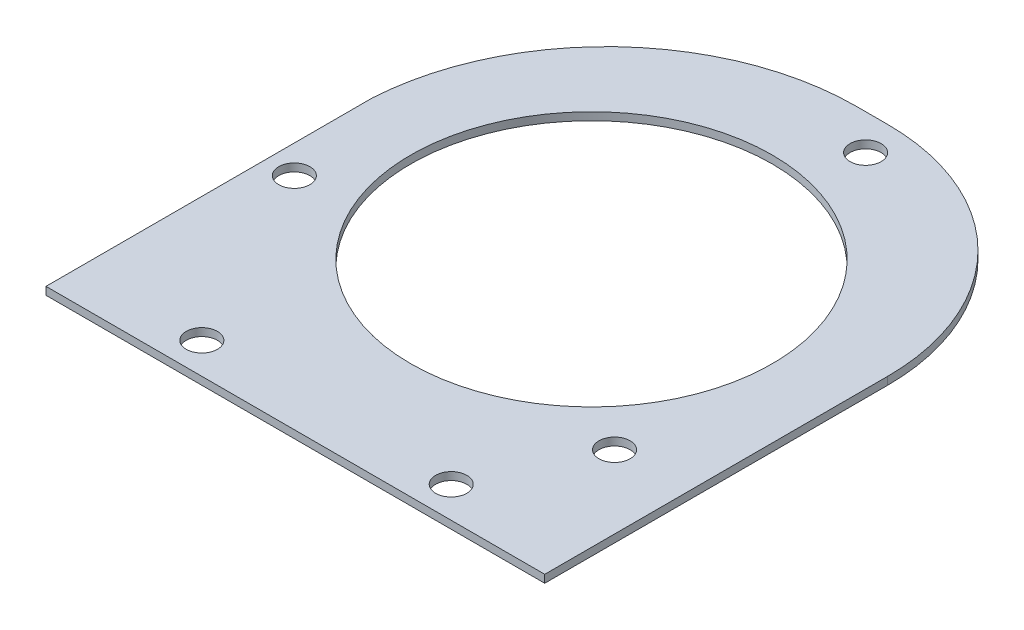
ISO-10303-21;
HEADER;
FILE_DESCRIPTION(('STEP AP214'),'2;1');
FILE_NAME('part.step','',(''),(''),'','','');
FILE_SCHEMA(('AUTOMOTIVE_DESIGN { 1 0 10303 214 1 1 1 1 }'));
ENDSEC;
DATA;
#1=APPLICATION_CONTEXT('core data for automotive mechanical design processes');
#2=APPLICATION_PROTOCOL_DEFINITION('international standard','automotive_design',2000,#1);
#3=PRODUCT_CONTEXT('',#1,'mechanical');
#4=PRODUCT('Part','Part','',(#3));
#5=PRODUCT_RELATED_PRODUCT_CATEGORY('part','',(#4));
#6=PRODUCT_DEFINITION_FORMATION('','',#4);
#7=PRODUCT_DEFINITION_CONTEXT('part definition',#1,'design');
#8=PRODUCT_DEFINITION('design','',#6,#7);
#9=PRODUCT_DEFINITION_SHAPE('','',#8);
#10=(LENGTH_UNIT() NAMED_UNIT(*) SI_UNIT(.MILLI.,.METRE.));
#11=(NAMED_UNIT(*) PLANE_ANGLE_UNIT() SI_UNIT($,.RADIAN.));
#12=(NAMED_UNIT(*) SI_UNIT($,.STERADIAN.) SOLID_ANGLE_UNIT());
#13=UNCERTAINTY_MEASURE_WITH_UNIT(LENGTH_MEASURE(1.E-05),#10,'distance_accuracy_value','');
#14=(GEOMETRIC_REPRESENTATION_CONTEXT(3) GLOBAL_UNCERTAINTY_ASSIGNED_CONTEXT((#13)) GLOBAL_UNIT_ASSIGNED_CONTEXT((#10,
#11,#12)) REPRESENTATION_CONTEXT('',''));
#15=CARTESIAN_POINT('',(0.,0.,0.));
#16=DIRECTION('',(0.,0.,1.));
#17=DIRECTION('',(1.,0.,0.));
#18=AXIS2_PLACEMENT_3D('',#15,#16,#17);
#19=CARTESIAN_POINT('',(12.7,3.175,-25.4000000000001));
#20=DIRECTION('',(0.,-1.,0.));
#21=DIRECTION('',(0.,0.,-1.));
#22=AXIS2_PLACEMENT_3D('',#19,#20,#21);
#23=PLANE('',#22);
#24=CARTESIAN_POINT('',(18.174556809617,3.175,-99.84998922339));
#25=DIRECTION('',(0.,1.,0.));
#26=DIRECTION('',(0.,0.,1.));
#27=AXIS2_PLACEMENT_3D('',#24,#25,#26);
#28=CIRCLE('',#27,6.35000000000001);
#29=CARTESIAN_POINT('',(18.174556809617,3.175,-93.49998922339));
#30=VERTEX_POINT('',#29);
#31=EDGE_CURVE('E237',#30,#30,#28,.T.);
#32=ORIENTED_EDGE('',*,*,#31,.F.);
#33=EDGE_LOOP('',(#32));
#34=FACE_BOUND('',#33,.T.);
#35=CARTESIAN_POINT('',(-50.8,3.175,101.6));
#36=DIRECTION('',(0.,1.,0.));
#37=DIRECTION('',(0.,0.,1.));
#38=AXIS2_PLACEMENT_3D('',#35,#36,#37);
#39=CIRCLE('',#38,6.35);
#40=CARTESIAN_POINT('',(-50.8,3.175,107.95));
#41=VERTEX_POINT('',#40);
#42=EDGE_CURVE('E251',#41,#41,#39,.T.);
#43=ORIENTED_EDGE('',*,*,#42,.F.);
#44=EDGE_LOOP('',(#43));
#45=FACE_BOUND('',#44,.T.);
#46=CARTESIAN_POINT('',(0.,3.175,-6.35000000000014));
#47=DIRECTION('',(0.,1.,0.));
#48=DIRECTION('',(0.,0.,1.));
#49=AXIS2_PLACEMENT_3D('',#46,#47,#48);
#50=CIRCLE('',#49,73.66);
#51=CARTESIAN_POINT('',(0.,3.175,67.3099999999999));
#52=VERTEX_POINT('',#51);
#53=EDGE_CURVE('E150',#52,#52,#50,.T.);
#54=ORIENTED_EDGE('',*,*,#53,.F.);
#55=EDGE_LOOP('',(#54));
#56=FACE_BOUND('',#55,.T.);
#57=DIRECTION('',(0.,0.,1.));
#58=VECTOR('',#57,1.);
#59=CARTESIAN_POINT('',(-101.6,3.175,-18.6764705882367));
#60=LINE('',#59,#58);
#61=CARTESIAN_POINT('',(-101.6,3.175,-18.6764705882367));
#62=VERTEX_POINT('',#61);
#63=CARTESIAN_POINT('',(-101.6,3.175,114.3));
#64=VERTEX_POINT('',#63);
#65=EDGE_CURVE('E160',#62,#64,#60,.T.);
#66=ORIENTED_EDGE('',*,*,#65,.T.);
#67=DIRECTION('',(1.,0.,0.));
#68=VECTOR('',#67,1.);
#69=CARTESIAN_POINT('',(101.6,3.175,114.3));
#70=LINE('',#69,#68);
#71=CARTESIAN_POINT('',(101.6,3.175,114.3));
#72=VERTEX_POINT('',#71);
#73=EDGE_CURVE('E105',#64,#72,#70,.T.);
#74=ORIENTED_EDGE('',*,*,#73,.T.);
#75=DIRECTION('',(0.,0.,-1.));
#76=VECTOR('',#75,1.);
#77=CARTESIAN_POINT('',(101.6,3.175,-25.3999999999995));
#78=LINE('',#77,#76);
#79=CARTESIAN_POINT('',(101.6,3.175,-25.3999999999995));
#80=VERTEX_POINT('',#79);
#81=EDGE_CURVE('E121',#72,#80,#78,.T.);
#82=ORIENTED_EDGE('',*,*,#81,.T.);
#83=CARTESIAN_POINT('',(12.7,3.175,-25.4000000000001));
#84=DIRECTION('',(0.,1.,0.));
#85=DIRECTION('',(0.,0.,-1.));
#86=AXIS2_PLACEMENT_3D('',#83,#84,#85);
#87=CIRCLE('',#86,88.9);
#88=CARTESIAN_POINT('',(12.6999999999995,3.175,-114.3));
#89=VERTEX_POINT('',#88);
#90=EDGE_CURVE('E115',#80,#89,#87,.T.);
#91=ORIENTED_EDGE('',*,*,#90,.T.);
#92=DIRECTION('',(-1.,0.,0.));
#93=VECTOR('',#92,1.);
#94=CARTESIAN_POINT('',(12.6999999999995,3.175,-114.3));
#95=LINE('',#94,#93);
#96=CARTESIAN_POINT('',(0.,3.175,-114.3));
#97=VERTEX_POINT('',#96);
#98=EDGE_CURVE('E119',#89,#97,#95,.T.);
#99=ORIENTED_EDGE('',*,*,#98,.T.);
#100=CARTESIAN_POINT('',(0.,3.175,-12.5132352941176));
#101=DIRECTION('',(0.,1.,0.));
#102=DIRECTION('',(0.,0.,1.));
#103=AXIS2_PLACEMENT_3D('',#100,#101,#102);
#104=CIRCLE('',#103,101.786764705882);
#105=EDGE_CURVE('E62',#97,#62,#104,.T.);
#106=ORIENTED_EDGE('',*,*,#105,.T.);
#107=EDGE_LOOP('',(#66,#74,#82,#91,#99,#106));
#108=FACE_BOUND('',#107,.T.);
#109=CARTESIAN_POINT('',(-90.0606443258351,3.175,24.6603667120435));
#110=DIRECTION('',(0.,1.,0.));
#111=DIRECTION('',(0.,0.,1.));
#112=AXIS2_PLACEMENT_3D('',#109,#110,#111);
#113=CIRCLE('',#112,6.35);
#114=CARTESIAN_POINT('',(-90.0606443258351,3.175,31.0103667120435));
#115=VERTEX_POINT('',#114);
#116=EDGE_CURVE('E259',#115,#115,#113,.T.);
#117=ORIENTED_EDGE('',*,*,#116,.F.);
#118=EDGE_LOOP('',(#117));
#119=FACE_BOUND('',#118,.T.);
#120=CARTESIAN_POINT('',(50.8,3.175,101.6));
#121=DIRECTION('',(0.,1.,0.));
#122=DIRECTION('',(0.,0.,-1.));
#123=AXIS2_PLACEMENT_3D('',#120,#121,#122);
#124=CIRCLE('',#123,6.35);
#125=CARTESIAN_POINT('',(50.8,3.175,95.2499999999999));
#126=VERTEX_POINT('',#125);
#127=EDGE_CURVE('E244',#126,#126,#124,.T.);
#128=ORIENTED_EDGE('',*,*,#127,.F.);
#129=EDGE_LOOP('',(#128));
#130=FACE_BOUND('',#129,.T.);
#131=CARTESIAN_POINT('',(71.8860875162182,3.175,56.1396225113469));
#132=DIRECTION('',(0.,1.,0.));
#133=DIRECTION('',(0.,0.,1.));
#134=AXIS2_PLACEMENT_3D('',#131,#132,#133);
#135=CIRCLE('',#134,6.35000000000001);
#136=CARTESIAN_POINT('',(71.8860875162182,3.175,62.4896225113469));
#137=VERTEX_POINT('',#136);
#138=EDGE_CURVE('E226',#137,#137,#135,.T.);
#139=ORIENTED_EDGE('',*,*,#138,.F.);
#140=EDGE_LOOP('',(#139));
#141=FACE_BOUND('',#140,.T.);
#142=ADVANCED_FACE('F41',(#34,#45,#56,#108,#119,#130,#141),#23,.F.);
#143=CARTESIAN_POINT('',(12.7,0.,-25.4000000000001));
#144=DIRECTION('',(0.,-1.,0.));
#145=DIRECTION('',(0.,0.,-1.));
#146=AXIS2_PLACEMENT_3D('',#143,#144,#145);
#147=PLANE('',#146);
#148=CARTESIAN_POINT('',(18.174556809617,0.,-99.84998922339));
#149=DIRECTION('',(0.,1.,0.));
#150=DIRECTION('',(0.,0.,1.));
#151=AXIS2_PLACEMENT_3D('',#148,#149,#150);
#152=CIRCLE('',#151,6.35000000000001);
#153=CARTESIAN_POINT('',(18.174556809617,0.,-93.49998922339));
#154=VERTEX_POINT('',#153);
#155=EDGE_CURVE('E234',#154,#154,#152,.T.);
#156=ORIENTED_EDGE('',*,*,#155,.T.);
#157=EDGE_LOOP('',(#156));
#158=FACE_BOUND('',#157,.T.);
#159=CARTESIAN_POINT('',(-50.8,0.,101.6));
#160=DIRECTION('',(0.,1.,0.));
#161=DIRECTION('',(0.,0.,1.));
#162=AXIS2_PLACEMENT_3D('',#159,#160,#161);
#163=CIRCLE('',#162,6.35);
#164=CARTESIAN_POINT('',(-50.8,0.,107.95));
#165=VERTEX_POINT('',#164);
#166=EDGE_CURVE('E248',#165,#165,#163,.T.);
#167=ORIENTED_EDGE('',*,*,#166,.T.);
#168=EDGE_LOOP('',(#167));
#169=FACE_BOUND('',#168,.T.);
#170=CARTESIAN_POINT('',(0.,0.,-6.35000000000014));
#171=DIRECTION('',(0.,1.,0.));
#172=DIRECTION('',(0.,0.,1.));
#173=AXIS2_PLACEMENT_3D('',#170,#171,#172);
#174=CIRCLE('',#173,73.66);
#175=CARTESIAN_POINT('',(0.,0.,67.3099999999999));
#176=VERTEX_POINT('',#175);
#177=EDGE_CURVE('E263',#176,#176,#174,.T.);
#178=ORIENTED_EDGE('',*,*,#177,.T.);
#179=EDGE_LOOP('',(#178));
#180=FACE_BOUND('',#179,.T.);
#181=DIRECTION('',(0.,0.,1.));
#182=VECTOR('',#181,1.);
#183=CARTESIAN_POINT('',(-101.6,0.,-18.6764705882367));
#184=LINE('',#183,#182);
#185=CARTESIAN_POINT('',(-101.6,0.,-18.6764705882367));
#186=VERTEX_POINT('',#185);
#187=CARTESIAN_POINT('',(-101.6,0.,114.3));
#188=VERTEX_POINT('',#187);
#189=EDGE_CURVE('E145',#186,#188,#184,.T.);
#190=ORIENTED_EDGE('',*,*,#189,.F.);
#191=CARTESIAN_POINT('',(0.,0.,-12.5132352941176));
#192=DIRECTION('',(0.,1.,0.));
#193=DIRECTION('',(0.,0.,1.));
#194=AXIS2_PLACEMENT_3D('',#191,#192,#193);
#195=CIRCLE('',#194,101.786764705882);
#196=CARTESIAN_POINT('',(0.,0.,-114.3));
#197=VERTEX_POINT('',#196);
#198=EDGE_CURVE('E96',#197,#186,#195,.T.);
#199=ORIENTED_EDGE('',*,*,#198,.F.);
#200=DIRECTION('',(-1.,0.,0.));
#201=VECTOR('',#200,1.);
#202=CARTESIAN_POINT('',(12.6999999999995,0.,-114.3));
#203=LINE('',#202,#201);
#204=CARTESIAN_POINT('',(12.6999999999995,0.,-114.3));
#205=VERTEX_POINT('',#204);
#206=EDGE_CURVE('E90',#205,#197,#203,.T.);
#207=ORIENTED_EDGE('',*,*,#206,.F.);
#208=CARTESIAN_POINT('',(12.7,0.,-25.4000000000001));
#209=DIRECTION('',(0.,1.,0.));
#210=DIRECTION('',(0.,0.,-1.));
#211=AXIS2_PLACEMENT_3D('',#208,#209,#210);
#212=CIRCLE('',#211,88.9);
#213=CARTESIAN_POINT('',(101.6,0.,-25.3999999999995));
#214=VERTEX_POINT('',#213);
#215=EDGE_CURVE('E130',#214,#205,#212,.T.);
#216=ORIENTED_EDGE('',*,*,#215,.F.);
#217=DIRECTION('',(0.,0.,-1.));
#218=VECTOR('',#217,1.);
#219=CARTESIAN_POINT('',(101.6,0.,-25.3999999999995));
#220=LINE('',#219,#218);
#221=CARTESIAN_POINT('',(101.6,0.,114.3));
#222=VERTEX_POINT('',#221);
#223=EDGE_CURVE('E153',#222,#214,#220,.T.);
#224=ORIENTED_EDGE('',*,*,#223,.F.);
#225=DIRECTION('',(1.,0.,0.));
#226=VECTOR('',#225,1.);
#227=CARTESIAN_POINT('',(101.6,0.,114.3));
#228=LINE('',#227,#226);
#229=EDGE_CURVE('E149',#188,#222,#228,.T.);
#230=ORIENTED_EDGE('',*,*,#229,.F.);
#231=EDGE_LOOP('',(#190,#199,#207,#216,#224,#230));
#232=FACE_BOUND('',#231,.T.);
#233=CARTESIAN_POINT('',(-90.0606443258351,0.,24.6603667120435));
#234=DIRECTION('',(0.,1.,0.));
#235=DIRECTION('',(0.,0.,1.));
#236=AXIS2_PLACEMENT_3D('',#233,#234,#235);
#237=CIRCLE('',#236,6.35);
#238=CARTESIAN_POINT('',(-90.0606443258351,0.,31.0103667120435));
#239=VERTEX_POINT('',#238);
#240=EDGE_CURVE('E255',#239,#239,#237,.T.);
#241=ORIENTED_EDGE('',*,*,#240,.T.);
#242=EDGE_LOOP('',(#241));
#243=FACE_BOUND('',#242,.T.);
#244=CARTESIAN_POINT('',(50.8,0.,101.6));
#245=DIRECTION('',(0.,1.,0.));
#246=DIRECTION('',(0.,0.,-1.));
#247=AXIS2_PLACEMENT_3D('',#244,#245,#246);
#248=CIRCLE('',#247,6.35);
#249=CARTESIAN_POINT('',(50.8,0.,95.2499999999999));
#250=VERTEX_POINT('',#249);
#251=EDGE_CURVE('E241',#250,#250,#248,.T.);
#252=ORIENTED_EDGE('',*,*,#251,.T.);
#253=EDGE_LOOP('',(#252));
#254=FACE_BOUND('',#253,.T.);
#255=CARTESIAN_POINT('',(71.8860875162182,0.,56.1396225113469));
#256=DIRECTION('',(0.,1.,0.));
#257=DIRECTION('',(0.,0.,1.));
#258=AXIS2_PLACEMENT_3D('',#255,#256,#257);
#259=CIRCLE('',#258,6.35000000000001);
#260=CARTESIAN_POINT('',(71.8860875162182,0.,62.4896225113469));
#261=VERTEX_POINT('',#260);
#262=EDGE_CURVE('E229',#261,#261,#259,.T.);
#263=ORIENTED_EDGE('',*,*,#262,.T.);
#264=EDGE_LOOP('',(#263));
#265=FACE_BOUND('',#264,.T.);
#266=ADVANCED_FACE('F175',(#158,#169,#180,#232,#243,#254,#265),#147,.T.);
#267=CARTESIAN_POINT('',(-101.6,3.175,-18.6764705882367));
#268=DIRECTION('',(1.,0.,0.));
#269=DIRECTION('',(0.,0.,-1.));
#270=AXIS2_PLACEMENT_3D('',#267,#268,#269);
#271=PLANE('',#270);
#272=ORIENTED_EDGE('',*,*,#189,.T.);
#273=DIRECTION('',(0.,-1.,0.));
#274=VECTOR('',#273,1.);
#275=CARTESIAN_POINT('',(-101.6,3.175,114.3));
#276=LINE('',#275,#274);
#277=EDGE_CURVE('E11',#64,#188,#276,.T.);
#278=ORIENTED_EDGE('',*,*,#277,.F.);
#279=ORIENTED_EDGE('',*,*,#65,.F.);
#280=DIRECTION('',(0.,-1.,0.));
#281=VECTOR('',#280,1.);
#282=CARTESIAN_POINT('',(-101.6,3.175,-18.6764705882367));
#283=LINE('',#282,#281);
#284=EDGE_CURVE('E141',#62,#186,#283,.T.);
#285=ORIENTED_EDGE('',*,*,#284,.T.);
#286=EDGE_LOOP('',(#272,#278,#279,#285));
#287=FACE_BOUND('',#286,.T.);
#288=ADVANCED_FACE('F43',(#287),#271,.F.);
#289=CARTESIAN_POINT('',(101.6,3.175,114.3));
#290=DIRECTION('',(0.,0.,-1.));
#291=DIRECTION('',(-1.,0.,0.));
#292=AXIS2_PLACEMENT_3D('',#289,#290,#291);
#293=PLANE('',#292);
#294=ORIENTED_EDGE('',*,*,#229,.T.);
#295=DIRECTION('',(0.,-1.,0.));
#296=VECTOR('',#295,1.);
#297=CARTESIAN_POINT('',(101.6,3.175,114.3));
#298=LINE('',#297,#296);
#299=EDGE_CURVE('E51',#72,#222,#298,.T.);
#300=ORIENTED_EDGE('',*,*,#299,.F.);
#301=ORIENTED_EDGE('',*,*,#73,.F.);
#302=ORIENTED_EDGE('',*,*,#277,.T.);
#303=EDGE_LOOP('',(#294,#300,#301,#302));
#304=FACE_BOUND('',#303,.T.);
#305=ADVANCED_FACE('F324',(#304),#293,.F.);
#306=CARTESIAN_POINT('',(101.6,3.175,-25.3999999999995));
#307=DIRECTION('',(-1.,0.,0.));
#308=DIRECTION('',(0.,0.,1.));
#309=AXIS2_PLACEMENT_3D('',#306,#307,#308);
#310=PLANE('',#309);
#311=ORIENTED_EDGE('',*,*,#223,.T.);
#312=DIRECTION('',(0.,-1.,0.));
#313=VECTOR('',#312,1.);
#314=CARTESIAN_POINT('',(101.6,3.175,-25.3999999999995));
#315=LINE('',#314,#313);
#316=EDGE_CURVE('E132',#80,#214,#315,.T.);
#317=ORIENTED_EDGE('',*,*,#316,.F.);
#318=ORIENTED_EDGE('',*,*,#81,.F.);
#319=ORIENTED_EDGE('',*,*,#299,.T.);
#320=EDGE_LOOP('',(#311,#317,#318,#319));
#321=FACE_BOUND('',#320,.T.);
#322=ADVANCED_FACE('F172',(#321),#310,.F.);
#323=CARTESIAN_POINT('',(12.7,3.175,-25.4000000000001));
#324=DIRECTION('',(0.,-1.,0.));
#325=DIRECTION('',(0.,0.,-1.));
#326=AXIS2_PLACEMENT_3D('',#323,#324,#325);
#327=CYLINDRICAL_SURFACE('',#326,88.9);
#328=ORIENTED_EDGE('',*,*,#215,.T.);
#329=DIRECTION('',(0.,-1.,0.));
#330=VECTOR('',#329,1.);
#331=CARTESIAN_POINT('',(12.6999999999995,3.175,-114.3));
#332=LINE('',#331,#330);
#333=EDGE_CURVE('E127',#89,#205,#332,.T.);
#334=ORIENTED_EDGE('',*,*,#333,.F.);
#335=ORIENTED_EDGE('',*,*,#90,.F.);
#336=ORIENTED_EDGE('',*,*,#316,.T.);
#337=EDGE_LOOP('',(#328,#334,#335,#336));
#338=FACE_BOUND('',#337,.T.);
#339=ADVANCED_FACE('F128',(#338),#327,.T.);
#340=CARTESIAN_POINT('',(12.6999999999995,3.175,-114.3));
#341=DIRECTION('',(0.,0.,1.));
#342=DIRECTION('',(1.,0.,0.));
#343=AXIS2_PLACEMENT_3D('',#340,#341,#342);
#344=PLANE('',#343);
#345=ORIENTED_EDGE('',*,*,#206,.T.);
#346=DIRECTION('',(0.,-1.,0.));
#347=VECTOR('',#346,1.);
#348=CARTESIAN_POINT('',(0.,3.175,-114.3));
#349=LINE('',#348,#347);
#350=EDGE_CURVE('E133',#97,#197,#349,.T.);
#351=ORIENTED_EDGE('',*,*,#350,.F.);
#352=ORIENTED_EDGE('',*,*,#98,.F.);
#353=ORIENTED_EDGE('',*,*,#333,.T.);
#354=EDGE_LOOP('',(#345,#351,#352,#353));
#355=FACE_BOUND('',#354,.T.);
#356=ADVANCED_FACE('F135',(#355),#344,.F.);
#357=CARTESIAN_POINT('',(0.,3.175,-12.5132352941176));
#358=DIRECTION('',(0.,-1.,0.));
#359=DIRECTION('',(0.,0.,-1.));
#360=AXIS2_PLACEMENT_3D('',#357,#358,#359);
#361=CYLINDRICAL_SURFACE('',#360,101.786764705882);
#362=ORIENTED_EDGE('',*,*,#198,.T.);
#363=ORIENTED_EDGE('',*,*,#284,.F.);
#364=ORIENTED_EDGE('',*,*,#105,.F.);
#365=ORIENTED_EDGE('',*,*,#350,.T.);
#366=EDGE_LOOP('',(#362,#363,#364,#365));
#367=FACE_BOUND('',#366,.T.);
#368=ADVANCED_FACE('F180',(#367),#361,.T.);
#369=CARTESIAN_POINT('',(0.,3.175,-6.35000000000014));
#370=DIRECTION('',(0.,-1.,0.));
#371=DIRECTION('',(0.,0.,-1.));
#372=AXIS2_PLACEMENT_3D('',#369,#370,#371);
#373=CYLINDRICAL_SURFACE('',#372,73.66);
#374=ORIENTED_EDGE('',*,*,#53,.T.);
#375=EDGE_LOOP('',(#374));
#376=FACE_BOUND('',#375,.T.);
#377=ORIENTED_EDGE('',*,*,#177,.F.);
#378=EDGE_LOOP('',(#377));
#379=FACE_BOUND('',#378,.T.);
#380=ADVANCED_FACE('F182',(#376,#379),#373,.F.);
#381=CARTESIAN_POINT('',(-90.0606443258351,3.175,24.6603667120435));
#382=DIRECTION('',(0.,-1.,0.));
#383=DIRECTION('',(0.,0.,-1.));
#384=AXIS2_PLACEMENT_3D('',#381,#382,#383);
#385=CYLINDRICAL_SURFACE('',#384,6.35);
#386=ORIENTED_EDGE('',*,*,#116,.T.);
#387=EDGE_LOOP('',(#386));
#388=FACE_BOUND('',#387,.T.);
#389=ORIENTED_EDGE('',*,*,#240,.F.);
#390=EDGE_LOOP('',(#389));
#391=FACE_BOUND('',#390,.T.);
#392=ADVANCED_FACE('F188',(#388,#391),#385,.F.);
#393=CARTESIAN_POINT('',(-50.8,3.175,101.6));
#394=DIRECTION('',(0.,-1.,0.));
#395=DIRECTION('',(0.,0.,-1.));
#396=AXIS2_PLACEMENT_3D('',#393,#394,#395);
#397=CYLINDRICAL_SURFACE('',#396,6.35);
#398=ORIENTED_EDGE('',*,*,#42,.T.);
#399=EDGE_LOOP('',(#398));
#400=FACE_BOUND('',#399,.T.);
#401=ORIENTED_EDGE('',*,*,#166,.F.);
#402=EDGE_LOOP('',(#401));
#403=FACE_BOUND('',#402,.T.);
#404=ADVANCED_FACE('F205',(#400,#403),#397,.F.);
#405=CARTESIAN_POINT('',(50.8,3.175,101.6));
#406=DIRECTION('',(0.,-1.,0.));
#407=DIRECTION('',(0.,0.,-1.));
#408=AXIS2_PLACEMENT_3D('',#405,#406,#407);
#409=CYLINDRICAL_SURFACE('',#408,6.35);
#410=ORIENTED_EDGE('',*,*,#127,.T.);
#411=EDGE_LOOP('',(#410));
#412=FACE_BOUND('',#411,.T.);
#413=ORIENTED_EDGE('',*,*,#251,.F.);
#414=EDGE_LOOP('',(#413));
#415=FACE_BOUND('',#414,.T.);
#416=ADVANCED_FACE('F209',(#412,#415),#409,.F.);
#417=CARTESIAN_POINT('',(18.174556809617,3.175,-99.84998922339));
#418=DIRECTION('',(0.,-1.,0.));
#419=DIRECTION('',(0.,0.,-1.));
#420=AXIS2_PLACEMENT_3D('',#417,#418,#419);
#421=CYLINDRICAL_SURFACE('',#420,6.35000000000001);
#422=ORIENTED_EDGE('',*,*,#31,.T.);
#423=EDGE_LOOP('',(#422));
#424=FACE_BOUND('',#423,.T.);
#425=ORIENTED_EDGE('',*,*,#155,.F.);
#426=EDGE_LOOP('',(#425));
#427=FACE_BOUND('',#426,.T.);
#428=ADVANCED_FACE('F213',(#424,#427),#421,.F.);
#429=CARTESIAN_POINT('',(71.8860875162182,3.175,56.1396225113469));
#430=DIRECTION('',(0.,-1.,0.));
#431=DIRECTION('',(0.,0.,-1.));
#432=AXIS2_PLACEMENT_3D('',#429,#430,#431);
#433=CYLINDRICAL_SURFACE('',#432,6.35000000000001);
#434=ORIENTED_EDGE('',*,*,#138,.T.);
#435=EDGE_LOOP('',(#434));
#436=FACE_BOUND('',#435,.T.);
#437=ORIENTED_EDGE('',*,*,#262,.F.);
#438=EDGE_LOOP('',(#437));
#439=FACE_BOUND('',#438,.T.);
#440=ADVANCED_FACE('F217',(#436,#439),#433,.F.);
#441=CLOSED_SHELL('',(#142,#266,#288,#305,#322,#339,#356,#368,#380,#392,#404,#416,#428,#440));
#442=MANIFOLD_SOLID_BREP('B2',#441);
#443=ADVANCED_BREP_SHAPE_REPRESENTATION('',(#18,#442),#14);
#444=SHAPE_DEFINITION_REPRESENTATION(#9,#443);
ENDSEC;
END-ISO-10303-21;
